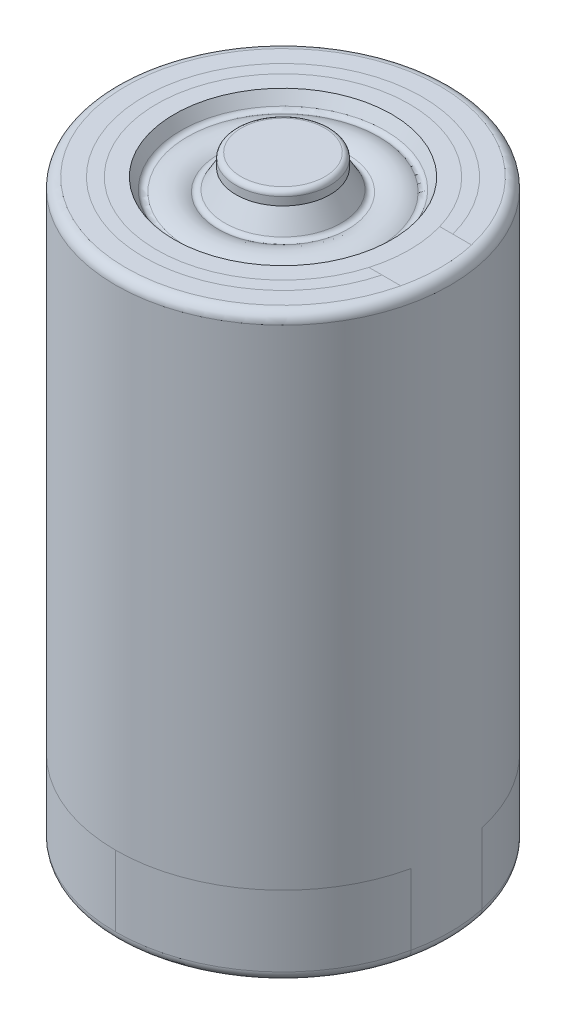
ISO-10303-21;
HEADER;
FILE_DESCRIPTION(('STEP AP214'),'2;1');
FILE_NAME('part.step','',(''),(''),'','','');
FILE_SCHEMA(('AUTOMOTIVE_DESIGN { 1 0 10303 214 1 1 1 1 }'));
ENDSEC;
DATA;
#1=APPLICATION_CONTEXT('core data for automotive mechanical design processes');
#2=APPLICATION_PROTOCOL_DEFINITION('international standard','automotive_design',2000,#1);
#3=PRODUCT_CONTEXT('',#1,'mechanical');
#4=PRODUCT('Part','Part','',(#3));
#5=PRODUCT_RELATED_PRODUCT_CATEGORY('part','',(#4));
#6=PRODUCT_DEFINITION_FORMATION('','',#4);
#7=PRODUCT_DEFINITION_CONTEXT('part definition',#1,'design');
#8=PRODUCT_DEFINITION('design','',#6,#7);
#9=PRODUCT_DEFINITION_SHAPE('','',#8);
#10=(LENGTH_UNIT() NAMED_UNIT(*) SI_UNIT(.MILLI.,.METRE.));
#11=(NAMED_UNIT(*) PLANE_ANGLE_UNIT() SI_UNIT($,.RADIAN.));
#12=(NAMED_UNIT(*) SI_UNIT($,.STERADIAN.) SOLID_ANGLE_UNIT());
#13=UNCERTAINTY_MEASURE_WITH_UNIT(LENGTH_MEASURE(1.E-05),#10,'distance_accuracy_value','');
#14=(GEOMETRIC_REPRESENTATION_CONTEXT(3) GLOBAL_UNCERTAINTY_ASSIGNED_CONTEXT((#13)) GLOBAL_UNIT_ASSIGNED_CONTEXT((#10,
#11,#12)) REPRESENTATION_CONTEXT('',''));
#15=CARTESIAN_POINT('',(0.,0.,0.));
#16=DIRECTION('',(0.,0.,1.));
#17=DIRECTION('',(1.,0.,0.));
#18=AXIS2_PLACEMENT_3D('',#15,#16,#17);
#19=CARTESIAN_POINT('',(15.55,58.9,0.));
#20=DIRECTION('',(0.,1.,0.));
#21=DIRECTION('',(0.,0.,1.));
#22=AXIS2_PLACEMENT_3D('',#19,#20,#21);
#23=PLANE('',#22);
#24=DIRECTION('',(-1.,0.,0.));
#25=VECTOR('',#24,1.);
#26=CARTESIAN_POINT('',(15.55,58.9,-3.5));
#27=LINE('',#26,#25);
#28=CARTESIAN_POINT('',(13.2970861469722,58.9,-3.5));
#29=VERTEX_POINT('',#28);
#30=CARTESIAN_POINT('',(12.,58.9,-3.5));
#31=VERTEX_POINT('',#30);
#32=EDGE_CURVE('E296',#29,#31,#27,.T.);
#33=ORIENTED_EDGE('',*,*,#32,.F.);
#34=CARTESIAN_POINT('',(0.,58.9,0.));
#35=DIRECTION('',(0.,1.,0.));
#36=DIRECTION('',(0.,0.,1.));
#37=AXIS2_PLACEMENT_3D('',#34,#35,#36);
#38=CIRCLE('',#37,13.75);
#39=CARTESIAN_POINT('',(13.2970861469722,58.9,3.5));
#40=VERTEX_POINT('',#39);
#41=EDGE_CURVE('E11',#29,#40,#38,.T.);
#42=ORIENTED_EDGE('',*,*,#41,.T.);
#43=DIRECTION('',(1.,0.,0.));
#44=VECTOR('',#43,1.);
#45=CARTESIAN_POINT('',(15.55,58.9,3.5));
#46=LINE('',#45,#44);
#47=CARTESIAN_POINT('',(12.,58.9,3.5));
#48=VERTEX_POINT('',#47);
#49=EDGE_CURVE('E297',#48,#40,#46,.T.);
#50=ORIENTED_EDGE('',*,*,#49,.F.);
#51=CARTESIAN_POINT('',(0.,58.9,0.));
#52=DIRECTION('',(0.,1.,0.));
#53=DIRECTION('',(0.,0.,1.));
#54=AXIS2_PLACEMENT_3D('',#51,#52,#53);
#55=CIRCLE('',#54,12.5);
#56=EDGE_CURVE('E161',#48,#31,#55,.F.);
#57=ORIENTED_EDGE('',*,*,#56,.T.);
#58=EDGE_LOOP('',(#33,#42,#50,#57));
#59=FACE_BOUND('',#58,.T.);
#60=ADVANCED_FACE('F40',(#59),#23,.T.);
#61=CARTESIAN_POINT('',(0.,58.9,0.));
#62=DIRECTION('',(0.,-1.,0.));
#63=DIRECTION('',(0.,0.,-1.));
#64=AXIS2_PLACEMENT_3D('',#61,#62,#63);
#65=CIRCLE('',#64,15.55);
#66=CARTESIAN_POINT('',(15.150990066659,58.9,-3.5));
#67=VERTEX_POINT('',#66);
#68=CARTESIAN_POINT('',(15.150990066659,58.9,3.5));
#69=VERTEX_POINT('',#68);
#70=EDGE_CURVE('E312',#67,#69,#65,.T.);
#71=ORIENTED_EDGE('',*,*,#70,.F.);
#72=EDGE_CURVE('E49',#67,#29,#27,.T.);
#73=ORIENTED_EDGE('',*,*,#72,.T.);
#74=ORIENTED_EDGE('',*,*,#32,.T.);
#75=EDGE_CURVE('E160',#31,#48,#55,.F.);
#76=ORIENTED_EDGE('',*,*,#75,.T.);
#77=ORIENTED_EDGE('',*,*,#49,.T.);
#78=EDGE_CURVE('E288',#40,#69,#46,.T.);
#79=ORIENTED_EDGE('',*,*,#78,.T.);
#80=EDGE_LOOP('',(#71,#73,#74,#76,#77,#79));
#81=FACE_BOUND('',#80,.T.);
#82=ADVANCED_FACE('F229',(#81),#23,.T.);
#83=CARTESIAN_POINT('',(0.,0.,0.));
#84=DIRECTION('',(0.,-1.,0.));
#85=DIRECTION('',(0.,0.,-1.));
#86=AXIS2_PLACEMENT_3D('',#83,#84,#85);
#87=CYLINDRICAL_SURFACE('',#86,16.55);
#88=CARTESIAN_POINT('',(0.,57.9,0.));
#89=DIRECTION('',(0.,-1.,0.));
#90=DIRECTION('',(0.,0.,-1.));
#91=AXIS2_PLACEMENT_3D('',#88,#89,#90);
#92=CIRCLE('',#91,16.55);
#93=CARTESIAN_POINT('',(0.,57.9,-16.55));
#94=VERTEX_POINT('',#93);
#95=EDGE_CURVE('E130',#94,#94,#92,.T.);
#96=ORIENTED_EDGE('',*,*,#95,.T.);
#97=EDGE_LOOP('',(#96));
#98=FACE_BOUND('',#97,.T.);
#99=CARTESIAN_POINT('',(0.,9.5,0.));
#100=DIRECTION('',(0.,1.,0.));
#101=DIRECTION('',(0.,0.,1.));
#102=AXIS2_PLACEMENT_3D('',#99,#100,#101);
#103=CIRCLE('',#102,16.55);
#104=CARTESIAN_POINT('',(0.,9.5,-16.55));
#105=VERTEX_POINT('',#104);
#106=CARTESIAN_POINT('',(16.1756761837025,9.5,-3.5));
#107=VERTEX_POINT('',#106);
#108=EDGE_CURVE('E120',#105,#107,#103,.F.);
#109=ORIENTED_EDGE('',*,*,#108,.F.);
#110=CARTESIAN_POINT('',(0.,9.5,0.));
#111=DIRECTION('',(0.,-1.,0.));
#112=DIRECTION('',(0.,0.,-1.));
#113=AXIS2_PLACEMENT_3D('',#110,#111,#112);
#114=CIRCLE('',#113,16.55);
#115=CARTESIAN_POINT('',(0.,9.5,16.55));
#116=VERTEX_POINT('',#115);
#117=EDGE_CURVE('E114',#105,#116,#114,.F.);
#118=ORIENTED_EDGE('',*,*,#117,.T.);
#119=CARTESIAN_POINT('',(0.,9.5,0.));
#120=DIRECTION('',(0.,1.,0.));
#121=DIRECTION('',(0.,0.,1.));
#122=AXIS2_PLACEMENT_3D('',#119,#120,#121);
#123=CIRCLE('',#122,16.55);
#124=CARTESIAN_POINT('',(16.1756761837025,9.5,3.5));
#125=VERTEX_POINT('',#124);
#126=EDGE_CURVE('E171',#125,#116,#123,.F.);
#127=ORIENTED_EDGE('',*,*,#126,.F.);
#128=DIRECTION('',(0.,-1.,0.));
#129=VECTOR('',#128,1.);
#130=CARTESIAN_POINT('',(16.1756761837025,0.,3.5));
#131=LINE('',#130,#129);
#132=CARTESIAN_POINT('',(16.1756761837025,2.5,3.5));
#133=VERTEX_POINT('',#132);
#134=EDGE_CURVE('E175',#133,#125,#131,.F.);
#135=ORIENTED_EDGE('',*,*,#134,.F.);
#136=CARTESIAN_POINT('',(0.,2.5,0.));
#137=DIRECTION('',(0.,-1.,0.));
#138=DIRECTION('',(0.,0.,-1.));
#139=AXIS2_PLACEMENT_3D('',#136,#137,#138);
#140=CIRCLE('',#139,16.55);
#141=CARTESIAN_POINT('',(16.1756761837025,2.5,-3.5));
#142=VERTEX_POINT('',#141);
#143=EDGE_CURVE('E138',#142,#133,#140,.T.);
#144=ORIENTED_EDGE('',*,*,#143,.F.);
#145=DIRECTION('',(0.,-1.,0.));
#146=VECTOR('',#145,1.);
#147=CARTESIAN_POINT('',(16.1756761837025,0.,-3.5));
#148=LINE('',#147,#146);
#149=EDGE_CURVE('E135',#107,#142,#148,.T.);
#150=ORIENTED_EDGE('',*,*,#149,.F.);
#151=EDGE_LOOP('',(#109,#118,#127,#135,#144,#150));
#152=FACE_BOUND('',#151,.T.);
#153=ADVANCED_FACE('F226',(#98,#152),#87,.T.);
#154=CARTESIAN_POINT('',(12.5,1.5,0.));
#155=DIRECTION('',(0.,-1.,0.));
#156=DIRECTION('',(0.,0.,-1.));
#157=AXIS2_PLACEMENT_3D('',#154,#155,#156);
#158=PLANE('',#157);
#159=CARTESIAN_POINT('',(0.,1.5,0.));
#160=DIRECTION('',(0.,-1.,0.));
#161=DIRECTION('',(0.,0.,-1.));
#162=AXIS2_PLACEMENT_3D('',#159,#160,#161);
#163=CIRCLE('',#162,12.5);
#164=CARTESIAN_POINT('',(12.,1.5,3.5));
#165=VERTEX_POINT('',#164);
#166=CARTESIAN_POINT('',(12.,1.5,-3.5));
#167=VERTEX_POINT('',#166);
#168=EDGE_CURVE('E147',#165,#167,#163,.T.);
#169=ORIENTED_EDGE('',*,*,#168,.F.);
#170=DIRECTION('',(1.,0.,0.));
#171=VECTOR('',#170,1.);
#172=CARTESIAN_POINT('',(12.5,1.5,3.5));
#173=LINE('',#172,#171);
#174=CARTESIAN_POINT('',(15.150990066659,1.5,3.5));
#175=VERTEX_POINT('',#174);
#176=EDGE_CURVE('E179',#165,#175,#173,.T.);
#177=ORIENTED_EDGE('',*,*,#176,.T.);
#178=CARTESIAN_POINT('',(0.,1.5,0.));
#179=DIRECTION('',(0.,-1.,0.));
#180=DIRECTION('',(0.,0.,-1.));
#181=AXIS2_PLACEMENT_3D('',#178,#179,#180);
#182=CIRCLE('',#181,15.55);
#183=CARTESIAN_POINT('',(15.150990066659,1.5,-3.5));
#184=VERTEX_POINT('',#183);
#185=EDGE_CURVE('E137',#175,#184,#182,.T.);
#186=ORIENTED_EDGE('',*,*,#185,.T.);
#187=DIRECTION('',(-1.,0.,0.));
#188=VECTOR('',#187,1.);
#189=CARTESIAN_POINT('',(12.5,1.5,-3.5));
#190=LINE('',#189,#188);
#191=EDGE_CURVE('E182',#184,#167,#190,.T.);
#192=ORIENTED_EDGE('',*,*,#191,.T.);
#193=EDGE_LOOP('',(#169,#177,#186,#192));
#194=FACE_BOUND('',#193,.T.);
#195=ADVANCED_FACE('F219',(#194),#158,.T.);
#196=CARTESIAN_POINT('',(0.,2.5,0.));
#197=DIRECTION('',(0.,-1.,0.));
#198=DIRECTION('',(0.,0.,-1.));
#199=AXIS2_PLACEMENT_3D('',#196,#197,#198);
#200=TOROIDAL_SURFACE('',#199,15.55,1.);
#201=ORIENTED_EDGE('',*,*,#185,.F.);
#202=CARTESIAN_POINT('',(14.1792530394342,2.17340566572106,3.5));
#203=CARTESIAN_POINT('',(14.1980885138474,2.12049279659511,3.5));
#204=CARTESIAN_POINT('',(14.2214972506418,2.0691583762498,3.5));
#205=CARTESIAN_POINT('',(14.2766855043797,1.97114621986057,3.5));
#206=CARTESIAN_POINT('',(14.3084772069403,1.92447540020742,3.5));
#207=CARTESIAN_POINT('',(14.3793475188211,1.83716868918232,3.5));
#208=CARTESIAN_POINT('',(14.4184141657294,1.7965230846489,3.5));
#209=CARTESIAN_POINT('',(14.5026793451496,1.72222042642383,3.5));
#210=CARTESIAN_POINT('',(14.5478764693641,1.68856177216556,3.5));
#211=CARTESIAN_POINT('',(14.644105494877,1.62841342255395,3.5));
#212=CARTESIAN_POINT('',(14.6952378387754,1.60208445776696,3.5));
#213=CARTESIAN_POINT('',(14.801126945938,1.55815607837396,3.5));
#214=CARTESIAN_POINT('',(14.8558843301604,1.54055816377804,3.5));
#215=CARTESIAN_POINT('',(14.968847536997,1.51420411668053,3.5));
#216=CARTESIAN_POINT('',(15.0271041416763,1.50566530267801,3.5));
#217=CARTESIAN_POINT('',(15.1442286742494,1.49838891803839,3.5));
#218=CARTESIAN_POINT('',(15.2030966474452,1.49965207896906,3.5));
#219=CARTESIAN_POINT('',(15.3203425768103,1.51202610271029,3.5));
#220=CARTESIAN_POINT('',(15.378711002042,1.52322770824379,3.5));
#221=CARTESIAN_POINT('',(15.4927137555938,1.55534767112197,3.5));
#222=CARTESIAN_POINT('',(15.5483481420383,1.57626582179862,3.5));
#223=CARTESIAN_POINT('',(15.6548075156251,1.62709965563068,3.5));
#224=CARTESIAN_POINT('',(15.7056669842364,1.65694304922122,3.5));
#225=CARTESIAN_POINT('',(15.8015165521876,1.72491225428569,3.5));
#226=CARTESIAN_POINT('',(15.8465072488182,1.76303722185312,3.5));
#227=CARTESIAN_POINT('',(15.9283481648053,1.84567135588212,3.5));
#228=CARTESIAN_POINT('',(15.9653452353455,1.89003503662328,3.5));
#229=CARTESIAN_POINT('',(16.0311523368344,1.98446922935521,3.5));
#230=CARTESIAN_POINT('',(16.0599634965048,2.0345389532279,3.5));
#231=CARTESIAN_POINT('',(16.1078783990741,2.13770019930855,3.5));
#232=CARTESIAN_POINT('',(16.1271936016183,2.19069354266517,3.5));
#233=CARTESIAN_POINT('',(16.1564793898157,2.29920171347817,3.5));
#234=CARTESIAN_POINT('',(16.1664510074074,2.35471626177355,3.5));
#235=CARTESIAN_POINT('',(16.1766338711888,2.46568029167508,3.5));
#236=CARTESIAN_POINT('',(16.1770078363382,2.52111489861636,3.5));
#237=CARTESIAN_POINT('',(16.1683977588488,2.63125045383887,3.5));
#238=CARTESIAN_POINT('',(16.1594141361335,2.68595143493014,3.5));
#239=CARTESIAN_POINT('',(16.1324377153513,2.79282593225581,3.5));
#240=CARTESIAN_POINT('',(16.1144845434958,2.84500946795584,3.5));
#241=CARTESIAN_POINT('',(16.0701516266678,2.94566192610818,3.5));
#242=CARTESIAN_POINT('',(16.0437716345368,2.99413073955596,3.5));
#243=CARTESIAN_POINT('',(15.9831016507719,3.08648995131144,3.5));
#244=CARTESIAN_POINT('',(15.9487393302178,3.13033280322636,3.5));
#245=CARTESIAN_POINT('',(15.8732726955601,3.21176690998437,3.5));
#246=CARTESIAN_POINT('',(15.8321677852943,3.24935761143622,3.5));
#247=CARTESIAN_POINT('',(15.7435238421898,3.31802698337334,3.5));
#248=CARTESIAN_POINT('',(15.6958734832165,3.34896190321056,3.5));
#249=CARTESIAN_POINT('',(15.5961483269654,3.40260316987112,3.5));
#250=CARTESIAN_POINT('',(15.5440730027686,3.42530853502999,3.5));
#251=CARTESIAN_POINT('',(15.4356864485562,3.46238999863009,3.5));
#252=CARTESIAN_POINT('',(15.3793050715459,3.47656113649083,3.5));
#253=CARTESIAN_POINT('',(15.2649771265665,3.49541815122838,3.5));
#254=CARTESIAN_POINT('',(15.2070303895885,3.50010299970875,3.5));
#255=CARTESIAN_POINT('',(15.0901343313939,3.49989173807861,3.5));
#256=CARTESIAN_POINT('',(15.0311852546874,3.49482611365658,3.5));
#257=CARTESIAN_POINT('',(14.9149597562041,3.47491202152046,3.5));
#258=CARTESIAN_POINT('',(14.8576834261679,3.46006301829179,3.5));
#259=CARTESIAN_POINT('',(14.7462285367284,3.42087819143804,3.5));
#260=CARTESIAN_POINT('',(14.6920622707713,3.39650734319539,3.5));
#261=CARTESIAN_POINT('',(14.5886660287345,3.33889683289107,3.5));
#262=CARTESIAN_POINT('',(14.5394358148297,3.30565759840205,3.5));
#263=CARTESIAN_POINT('',(14.4480715799828,3.23169524558589,3.5));
#264=CARTESIAN_POINT('',(14.4058495527422,3.19108093673123,3.5));
#265=CARTESIAN_POINT('',(14.3290510529767,3.10317214968824,3.5));
#266=CARTESIAN_POINT('',(14.2944731258329,3.05587894525907,3.5));
#267=CARTESIAN_POINT('',(14.2349339944407,2.9572928695666,3.5));
#268=CARTESIAN_POINT('',(14.2097419998531,2.90613939304389,3.5));
#269=CARTESIAN_POINT('',(14.1685645793199,2.80023507331703,3.5));
#270=CARTESIAN_POINT('',(14.1525800160275,2.74548389357575,3.5));
#271=CARTESIAN_POINT('',(14.1306760327388,2.63548524437515,3.5));
#272=CARTESIAN_POINT('',(14.124506992378,2.58028723235342,3.5));
#273=CARTESIAN_POINT('',(14.1216672432118,2.46969773329597,3.5));
#274=CARTESIAN_POINT('',(14.1249834733281,2.41430661710373,3.5));
#275=CARTESIAN_POINT('',(14.1375927354538,2.32793353360577,3.5));
#276=CARTESIAN_POINT('',(14.1437915309908,2.2964681845692,3.5));
#277=CARTESIAN_POINT('',(14.1592483577381,2.2342991767761,3.5));
#278=CARTESIAN_POINT('',(14.1685063181158,2.20359550040128,3.5));
#279=CARTESIAN_POINT('',(14.1792530394342,2.17340566572106,3.5));
#280=B_SPLINE_CURVE_WITH_KNOTS('',3,(#202,#203,#204,#205,#206,#207,#208,#209,#210,#211,#212,
#213,#214,#215,#216,#217,#218,#219,#220,#221,#222,#223,#224,#225,#226,#227,#228,#229,#230,#231,
#232,#233,#234,#235,#236,#237,#238,#239,#240,#241,#242,#243,#244,#245,#246,#247,#248,#249,#250,
#251,#252,#253,#254,#255,#256,#257,#258,#259,#260,#261,#262,#263,#264,#265,#266,#267,#268,#269,
#270,#271,#272,#273,#274,#275,#276,#277,#278,#279),.UNSPECIFIED.,.T.,.F.,(4,2,2,2,2,2,2,2,2,2,2,
2,2,2,2,2,2,2,2,2,2,2,2,2,2,2,2,2,2,2,2,2,2,2,2,2,2,2,4),(0.,0.168375191465292,
0.336996498205606,0.505342945678527,0.673650785780169,0.845401490657697,1.01718169240563,
1.19299549836645,1.36882242627011,1.54627145009113,1.72371669979674,1.89976196669544,
2.07578930269005,2.24823938806772,2.42066568345953,2.58905551344316,2.75742674366602,
2.92294148087218,3.08844879089243,3.25323129403098,3.4180186306844,3.58436176747291,
3.75071961982256,3.92037292488756,4.09004646043412,4.26364739098436,4.43726714038093,
4.61393258988481,4.7906077103609,4.96793891538548,5.14526157226223,5.32015403019636,
5.49501317861412,5.66523340280073,5.8354695724936,6.00130296919659,6.16690812572114,
6.262978079427,6.35904580885761),.UNSPECIFIED.);
#281=EDGE_CURVE('E185',#175,#133,#280,.T.);
#282=ORIENTED_EDGE('',*,*,#281,.T.);
#283=CARTESIAN_POINT('',(0.,2.5,16.55));
#284=VERTEX_POINT('',#283);
#285=EDGE_CURVE('E129',#133,#284,#140,.T.);
#286=ORIENTED_EDGE('',*,*,#285,.T.);
#287=CARTESIAN_POINT('',(0.,2.5,-16.55));
#288=VERTEX_POINT('',#287);
#289=EDGE_CURVE('E112',#284,#288,#140,.T.);
#290=ORIENTED_EDGE('',*,*,#289,.T.);
#291=EDGE_CURVE('E127',#288,#142,#140,.T.);
#292=ORIENTED_EDGE('',*,*,#291,.T.);
#293=CARTESIAN_POINT('',(14.1792530394342,2.17340566572106,-3.5));
#294=CARTESIAN_POINT('',(14.1609222950065,2.22491621097577,-3.5));
#295=CARTESIAN_POINT('',(14.1468977634147,2.27799719610933,-3.5));
#296=CARTESIAN_POINT('',(14.1279536754817,2.38579918462007,-3.5));
#297=CARTESIAN_POINT('',(14.1230430764598,2.44052174776349,-3.5));
#298=CARTESIAN_POINT('',(14.122510677666,2.55000090507969,-3.5));
#299=CARTESIAN_POINT('',(14.1268862415859,2.60475748518316,-3.5));
#300=CARTESIAN_POINT('',(14.1447733709821,2.71274291742323,-3.5));
#301=CARTESIAN_POINT('',(14.1582832031468,2.76597205740837,-3.5));
#302=CARTESIAN_POINT('',(14.1939873706628,2.86942669122505,-3.5));
#303=CARTESIAN_POINT('',(14.2161814446723,2.91965227539258,-3.5));
#304=CARTESIAN_POINT('',(14.2685456261083,3.01575500909275,-3.5));
#305=CARTESIAN_POINT('',(14.2987165063296,3.0616317367218,-3.5));
#306=CARTESIAN_POINT('',(14.366715164839,3.14862553184318,-3.5));
#307=CARTESIAN_POINT('',(14.404668988134,3.18964400955377,-3.5));
#308=CARTESIAN_POINT('',(14.4867602507689,3.26493557017998,-3.5));
#309=CARTESIAN_POINT('',(14.5308985060008,3.29920776164286,-3.5));
#310=CARTESIAN_POINT('',(14.6253955147586,3.36102645443747,-3.5));
#311=CARTESIAN_POINT('',(14.6758913771649,3.3883633838396,-3.5));
#312=CARTESIAN_POINT('',(14.780677022914,3.43440164803204,-3.5));
#313=CARTESIAN_POINT('',(14.8349673097577,3.45310183425588,-3.5));
#314=CARTESIAN_POINT('',(14.9472007925616,3.48176577511776,-3.5));
#315=CARTESIAN_POINT('',(15.0052003982373,3.49150898187393,-3.5));
#316=CARTESIAN_POINT('',(15.1220145903185,3.50123109136168,-3.5));
#317=CARTESIAN_POINT('',(15.1808292419767,3.50120920772972,-3.5));
#318=CARTESIAN_POINT('',(15.2982413684075,3.49133171259808,-3.5));
#319=CARTESIAN_POINT('',(15.356830382534,3.48137492565717,-3.5));
#320=CARTESIAN_POINT('',(15.4714855612331,3.45169970530641,-3.5));
#321=CARTESIAN_POINT('',(15.5275517577623,3.43198139558445,-3.5));
#322=CARTESIAN_POINT('',(15.6351308383301,3.38343478329728,-3.5));
#323=CARTESIAN_POINT('',(15.6866723977413,3.35467009689628,-3.5));
#324=CARTESIAN_POINT('',(15.7840648629202,3.28873005208754,-3.5));
#325=CARTESIAN_POINT('',(15.8299163314966,3.25155552652793,-3.5));
#326=CARTESIAN_POINT('',(15.9136390101968,3.17062284006579,-3.5));
#327=CARTESIAN_POINT('',(15.9516501821462,3.12700951538405,-3.5));
#328=CARTESIAN_POINT('',(16.019598748762,3.0338896656961,-3.5));
#329=CARTESIAN_POINT('',(16.049537250637,2.98438395020591,-3.5));
#330=CARTESIAN_POINT('',(16.0997540540722,2.88213938185274,-3.5));
#331=CARTESIAN_POINT('',(16.1202429744163,2.82950393997623,-3.5));
#332=CARTESIAN_POINT('',(16.1519137175737,2.72150423527792,-3.5));
#333=CARTESIAN_POINT('',(16.1630965986468,2.66614028349418,-3.5));
#334=CARTESIAN_POINT('',(16.1756743992253,2.55530170007038,-3.5));
#335=CARTESIAN_POINT('',(16.1772381194724,2.49984616519411,-3.5));
#336=CARTESIAN_POINT('',(16.1709782065751,2.3894694944497,-3.5));
#337=CARTESIAN_POINT('',(16.163155039399,2.33454833219156,-3.5));
#338=CARTESIAN_POINT('',(16.1384397385245,2.22709428794779,-3.5));
#339=CARTESIAN_POINT('',(16.1215955312153,2.17455036172479,-3.5));
#340=CARTESIAN_POINT('',(16.0793980747165,2.07300134789384,-3.5));
#341=CARTESIAN_POINT('',(16.0540446104031,2.02399634979216,-3.5));
#342=CARTESIAN_POINT('',(15.9953498860723,1.93044128958771,-3.5));
#343=CARTESIAN_POINT('',(15.9619415866721,1.88593331837568,-3.5));
#344=CARTESIAN_POINT('',(15.8882573954095,1.80302458161836,-3.5));
#345=CARTESIAN_POINT('',(15.8479809234463,1.76462433247456,-3.5));
#346=CARTESIAN_POINT('',(15.7608839955592,1.69421544722668,-3.5));
#347=CARTESIAN_POINT('',(15.7139520755659,1.66234473783164,-3.5));
#348=CARTESIAN_POINT('',(15.6155008324598,1.60672657443792,-3.5));
#349=CARTESIAN_POINT('',(15.5639809594728,1.58298009579843,-3.5));
#350=CARTESIAN_POINT('',(15.4565383657761,1.54371177780737,-3.5));
#351=CARTESIAN_POINT('',(15.4005412510105,1.52839342966933,-3.5));
#352=CARTESIAN_POINT('',(15.2867881615321,1.5071883191578,-3.5));
#353=CARTESIAN_POINT('',(15.2290319894475,1.50130261915858,-3.5));
#354=CARTESIAN_POINT('',(15.1122813836268,1.49906436144752,-3.5));
#355=CARTESIAN_POINT('',(15.0532835284746,1.50288707343176,-3.5));
#356=CARTESIAN_POINT('',(14.9367533186237,1.52033023673236,-3.5));
#357=CARTESIAN_POINT('',(14.8792209937832,1.53395088750311,-3.5));
#358=CARTESIAN_POINT('',(14.7669909172335,1.57073624130917,-3.5));
#359=CARTESIAN_POINT('',(14.7123076098373,1.5939450843218,-3.5));
#360=CARTESIAN_POINT('',(14.6076662347656,1.64933406976874,-3.5));
#361=CARTESIAN_POINT('',(14.5577091497598,1.68151607242395,-3.5));
#362=CARTESIAN_POINT('',(14.4646523315352,1.75355809823595,-3.5));
#363=CARTESIAN_POINT('',(14.4214764843814,1.79331982485943,-3.5));
#364=CARTESIAN_POINT('',(14.3426756431821,1.8796705273337,-3.5));
#365=CARTESIAN_POINT('',(14.3070403016784,1.9262499969859,-3.5));
#366=CARTESIAN_POINT('',(14.2560725060756,2.00660642176866,-3.5));
#367=CARTESIAN_POINT('',(14.2381064835627,2.03874350047948,-3.5));
#368=CARTESIAN_POINT('',(14.2058619013813,2.10481877612477,-3.5));
#369=CARTESIAN_POINT('',(14.191583271203,2.13875693860423,-3.5));
#370=CARTESIAN_POINT('',(14.1792530394342,2.17340566572106,-3.5));
#371=B_SPLINE_CURVE_WITH_KNOTS('',3,(#293,#294,#295,#296,#297,#298,#299,#300,#301,#302,#303,
#304,#305,#306,#307,#308,#309,#310,#311,#312,#313,#314,#315,#316,#317,#318,#319,#320,#321,#322,
#323,#324,#325,#326,#327,#328,#329,#330,#331,#332,#333,#334,#335,#336,#337,#338,#339,#340,#341,
#342,#343,#344,#345,#346,#347,#348,#349,#350,#351,#352,#353,#354,#355,#356,#357,#358,#359,#360,
#361,#362,#363,#364,#365,#366,#367,#368,#369,#370),.UNSPECIFIED.,.T.,.F.,(4,2,2,2,2,2,2,2,2,2,2,
2,2,2,2,2,2,2,2,2,2,2,2,2,2,2,2,2,2,2,2,2,2,2,2,2,2,2,4),(0.,0.163892126883478,
0.327945244456745,0.491951794169707,0.655927230858092,0.819897733281622,0.983884127030807,
1.15077233695034,1.31768258465806,1.48915759347397,1.66065539951466,1.83627097244347,
2.01190068735208,2.18933743017591,2.36677192476317,2.54298555542883,2.71918174283592,
2.89189129438413,3.0645771458543,3.23320200022772,3.40180767637738,3.5674459531597,
3.73307600794223,3.89783471873896,4.06259759514091,4.22878222138923,4.39498089091296,
4.56439278459236,4.73382500998253,4.90718621497586,5.08056694381262,5.25709994548532,
5.43363654090159,5.61099505589527,5.78839036636002,5.96362491879542,6.13861742342475,
6.24886207622954,6.35910462079789),.UNSPECIFIED.);
#372=EDGE_CURVE('E178',#142,#184,#371,.T.);
#373=ORIENTED_EDGE('',*,*,#372,.T.);
#374=EDGE_LOOP('',(#201,#282,#286,#290,#292,#373));
#375=FACE_BOUND('',#374,.T.);
#376=ADVANCED_FACE('F125',(#375),#200,.T.);
#377=ORIENTED_EDGE('',*,*,#285,.F.);
#378=ORIENTED_EDGE('',*,*,#134,.T.);
#379=ORIENTED_EDGE('',*,*,#126,.T.);
#380=DIRECTION('',(0.,-1.,0.));
#381=VECTOR('',#380,1.);
#382=CARTESIAN_POINT('',(0.,0.,16.55));
#383=LINE('',#382,#381);
#384=EDGE_CURVE('E119',#284,#116,#383,.F.);
#385=ORIENTED_EDGE('',*,*,#384,.F.);
#386=EDGE_LOOP('',(#377,#378,#379,#385));
#387=FACE_BOUND('',#386,.T.);
#388=ADVANCED_FACE('F256',(#387),#87,.T.);
#389=ORIENTED_EDGE('',*,*,#291,.F.);
#390=DIRECTION('',(0.,-1.,0.));
#391=VECTOR('',#390,1.);
#392=CARTESIAN_POINT('',(0.,0.,-16.55));
#393=LINE('',#392,#391);
#394=EDGE_CURVE('E108',#288,#105,#393,.F.);
#395=ORIENTED_EDGE('',*,*,#394,.T.);
#396=ORIENTED_EDGE('',*,*,#108,.T.);
#397=ORIENTED_EDGE('',*,*,#149,.T.);
#398=EDGE_LOOP('',(#389,#395,#396,#397));
#399=FACE_BOUND('',#398,.T.);
#400=ADVANCED_FACE('F133',(#399),#87,.T.);
#401=ORIENTED_EDGE('',*,*,#41,.F.);
#402=ORIENTED_EDGE('',*,*,#72,.F.);
#403=EDGE_CURVE('E316',#69,#67,#65,.T.);
#404=ORIENTED_EDGE('',*,*,#403,.F.);
#405=ORIENTED_EDGE('',*,*,#78,.F.);
#406=EDGE_LOOP('',(#401,#402,#404,#405));
#407=FACE_BOUND('',#406,.T.);
#408=ADVANCED_FACE('F204',(#407),#23,.T.);
#409=CARTESIAN_POINT('',(0.,0.,0.));
#410=DIRECTION('',(0.,-1.,0.));
#411=DIRECTION('',(0.,0.,-1.));
#412=AXIS2_PLACEMENT_3D('',#409,#410,#411);
#413=PLANE('',#412);
#414=CARTESIAN_POINT('',(0.,0.,0.));
#415=DIRECTION('',(0.,-1.,0.));
#416=DIRECTION('',(0.,0.,-1.));
#417=AXIS2_PLACEMENT_3D('',#414,#415,#416);
#418=CIRCLE('',#417,9.);
#419=CARTESIAN_POINT('',(0.,0.,-9.));
#420=VERTEX_POINT('',#419);
#421=EDGE_CURVE('E157',#420,#420,#418,.T.);
#422=ORIENTED_EDGE('',*,*,#421,.T.);
#423=EDGE_LOOP('',(#422));
#424=FACE_BOUND('',#423,.T.);
#425=ADVANCED_FACE('F200',(#424),#413,.T.);
#426=CARTESIAN_POINT('',(0.,0.,0.));
#427=DIRECTION('',(0.,1.,0.));
#428=DIRECTION('',(0.,0.,1.));
#429=AXIS2_PLACEMENT_3D('',#426,#427,#428);
#430=CONICAL_SURFACE('',#429,9.,1.0471975511966);
#431=CARTESIAN_POINT('',(0.,0.5,0.));
#432=DIRECTION('',(0.,-1.,0.));
#433=DIRECTION('',(0.,0.,-1.));
#434=AXIS2_PLACEMENT_3D('',#431,#432,#433);
#435=CIRCLE('',#434,9.86602540378444);
#436=CARTESIAN_POINT('',(0.,0.5,-9.86602540378444));
#437=VERTEX_POINT('',#436);
#438=EDGE_CURVE('E154',#437,#437,#435,.T.);
#439=ORIENTED_EDGE('',*,*,#438,.T.);
#440=EDGE_LOOP('',(#439));
#441=FACE_BOUND('',#440,.T.);
#442=ORIENTED_EDGE('',*,*,#421,.F.);
#443=EDGE_LOOP('',(#442));
#444=FACE_BOUND('',#443,.T.);
#445=ADVANCED_FACE('F203',(#441,#444),#430,.T.);
#446=CARTESIAN_POINT('',(9.86602540378444,0.5,0.));
#447=DIRECTION('',(0.,-1.,0.));
#448=DIRECTION('',(0.,0.,-1.));
#449=AXIS2_PLACEMENT_3D('',#446,#447,#448);
#450=PLANE('',#449);
#451=CARTESIAN_POINT('',(0.,0.5,0.));
#452=DIRECTION('',(0.,-1.,0.));
#453=DIRECTION('',(0.,0.,-1.));
#454=AXIS2_PLACEMENT_3D('',#451,#452,#453);
#455=CIRCLE('',#454,11.5);
#456=CARTESIAN_POINT('',(0.,0.5,-11.5));
#457=VERTEX_POINT('',#456);
#458=EDGE_CURVE('E151',#457,#457,#455,.T.);
#459=ORIENTED_EDGE('',*,*,#458,.T.);
#460=EDGE_LOOP('',(#459));
#461=FACE_BOUND('',#460,.T.);
#462=ORIENTED_EDGE('',*,*,#438,.F.);
#463=EDGE_LOOP('',(#462));
#464=FACE_BOUND('',#463,.T.);
#465=ADVANCED_FACE('F208',(#461,#464),#450,.T.);
#466=CARTESIAN_POINT('',(0.,1.5,0.));
#467=DIRECTION('',(0.,-1.,0.));
#468=DIRECTION('',(0.,0.,-1.));
#469=AXIS2_PLACEMENT_3D('',#466,#467,#468);
#470=TOROIDAL_SURFACE('',#469,11.5,1.);
#471=EDGE_CURVE('E148',#167,#165,#163,.T.);
#472=ORIENTED_EDGE('',*,*,#471,.T.);
#473=ORIENTED_EDGE('',*,*,#168,.T.);
#474=EDGE_LOOP('',(#472,#473));
#475=FACE_BOUND('',#474,.T.);
#476=ORIENTED_EDGE('',*,*,#458,.F.);
#477=EDGE_LOOP('',(#476));
#478=FACE_BOUND('',#477,.T.);
#479=ADVANCED_FACE('F212',(#475,#478),#470,.T.);
#480=ORIENTED_EDGE('',*,*,#176,.F.);
#481=ORIENTED_EDGE('',*,*,#471,.F.);
#482=ORIENTED_EDGE('',*,*,#191,.F.);
#483=EDGE_CURVE('E140',#184,#175,#182,.T.);
#484=ORIENTED_EDGE('',*,*,#483,.T.);
#485=EDGE_LOOP('',(#480,#481,#482,#484));
#486=FACE_BOUND('',#485,.T.);
#487=ADVANCED_FACE('F215',(#486),#158,.T.);
#488=ORIENTED_EDGE('',*,*,#281,.F.);
#489=ORIENTED_EDGE('',*,*,#483,.F.);
#490=ORIENTED_EDGE('',*,*,#372,.F.);
#491=ORIENTED_EDGE('',*,*,#143,.T.);
#492=EDGE_LOOP('',(#488,#489,#490,#491));
#493=FACE_BOUND('',#492,.T.);
#494=ADVANCED_FACE('F194',(#493),#200,.T.);
#495=ORIENTED_EDGE('',*,*,#117,.F.);
#496=ORIENTED_EDGE('',*,*,#394,.F.);
#497=ORIENTED_EDGE('',*,*,#289,.F.);
#498=ORIENTED_EDGE('',*,*,#384,.T.);
#499=EDGE_LOOP('',(#495,#496,#497,#498));
#500=FACE_BOUND('',#499,.T.);
#501=ADVANCED_FACE('F110',(#500),#87,.T.);
#502=CARTESIAN_POINT('',(0.,57.9,0.));
#503=DIRECTION('',(0.,-1.,0.));
#504=DIRECTION('',(0.,0.,-1.));
#505=AXIS2_PLACEMENT_3D('',#502,#503,#504);
#506=TOROIDAL_SURFACE('',#505,15.55,1.);
#507=ORIENTED_EDGE('',*,*,#403,.T.);
#508=ORIENTED_EDGE('',*,*,#70,.T.);
#509=EDGE_LOOP('',(#507,#508));
#510=FACE_BOUND('',#509,.T.);
#511=ORIENTED_EDGE('',*,*,#95,.F.);
#512=EDGE_LOOP('',(#511));
#513=FACE_BOUND('',#512,.T.);
#514=ADVANCED_FACE('F241',(#510,#513),#506,.T.);
#515=ORIENTED_EDGE('',*,*,#56,.F.);
#516=ORIENTED_EDGE('',*,*,#75,.F.);
#517=EDGE_LOOP('',(#515,#516));
#518=FACE_BOUND('',#517,.T.);
#519=CARTESIAN_POINT('',(0.,58.9,0.));
#520=DIRECTION('',(0.,-1.,0.));
#521=DIRECTION('',(0.,0.,-1.));
#522=AXIS2_PLACEMENT_3D('',#519,#520,#521);
#523=CIRCLE('',#522,10.75);
#524=CARTESIAN_POINT('',(0.,58.9,-10.75));
#525=VERTEX_POINT('',#524);
#526=EDGE_CURVE('E317',#525,#525,#523,.T.);
#527=ORIENTED_EDGE('',*,*,#526,.T.);
#528=EDGE_LOOP('',(#527));
#529=FACE_BOUND('',#528,.T.);
#530=ADVANCED_FACE('F231',(#518,#529),#23,.T.);
#531=CARTESIAN_POINT('',(0.,58.9,0.));
#532=DIRECTION('',(0.,1.,0.));
#533=DIRECTION('',(0.,0.,1.));
#534=AXIS2_PLACEMENT_3D('',#531,#532,#533);
#535=CONICAL_SURFACE('',#534,10.75,0.523598775598295);
#536=CARTESIAN_POINT('',(0.,57.8113251934625,0.));
#537=DIRECTION('',(0.,-1.,0.));
#538=DIRECTION('',(0.,0.,-1.));
#539=AXIS2_PLACEMENT_3D('',#536,#537,#538);
#540=CIRCLE('',#539,10.1214533073856);
#541=CARTESIAN_POINT('',(0.,57.8113251934625,-10.1214533073856));
#542=VERTEX_POINT('',#541);
#543=EDGE_CURVE('E321',#542,#542,#540,.T.);
#544=ORIENTED_EDGE('',*,*,#543,.T.);
#545=EDGE_LOOP('',(#544));
#546=FACE_BOUND('',#545,.T.);
#547=ORIENTED_EDGE('',*,*,#526,.F.);
#548=EDGE_LOOP('',(#547));
#549=FACE_BOUND('',#548,.T.);
#550=ADVANCED_FACE('F240',(#546,#549),#535,.F.);
#551=CARTESIAN_POINT('',(0.,58.0613251934625,0.));
#552=DIRECTION('',(0.,-1.,0.));
#553=DIRECTION('',(0.,0.,-1.));
#554=AXIS2_PLACEMENT_3D('',#551,#552,#553);
#555=TOROIDAL_SURFACE('',#554,9.68844060549338,0.499999999999995);
#556=CARTESIAN_POINT('',(0.,57.6199723438076,0.));
#557=DIRECTION('',(0.,-1.,0.));
#558=DIRECTION('',(0.,0.,-1.));
#559=AXIS2_PLACEMENT_3D('',#556,#557,#558);
#560=CIRCLE('',#559,9.45347749753484);
#561=CARTESIAN_POINT('',(0.,57.6199723438076,-9.45347749753484));
#562=VERTEX_POINT('',#561);
#563=EDGE_CURVE('E324',#562,#562,#560,.T.);
#564=ORIENTED_EDGE('',*,*,#563,.T.);
#565=EDGE_LOOP('',(#564));
#566=FACE_BOUND('',#565,.T.);
#567=ORIENTED_EDGE('',*,*,#543,.F.);
#568=EDGE_LOOP('',(#567));
#569=FACE_BOUND('',#568,.T.);
#570=ADVANCED_FACE('F247',(#566,#569),#555,.F.);
#571=CARTESIAN_POINT('',(0.,54.7600501136382,0.));
#572=DIRECTION('',(0.,-1.,0.));
#573=DIRECTION('',(0.,0.,-1.));
#574=AXIS2_PLACEMENT_3D('',#571,#572,#573);
#575=TOROIDAL_SURFACE('',#574,7.93094010767585,3.23994988636181);
#576=CARTESIAN_POINT('',(0.,57.6199723438076,0.));
#577=DIRECTION('',(0.,-1.,0.));
#578=DIRECTION('',(0.,0.,-1.));
#579=AXIS2_PLACEMENT_3D('',#576,#577,#578);
#580=CIRCLE('',#579,6.40840271781687);
#581=CARTESIAN_POINT('',(0.,57.6199723438076,-6.40840271781687));
#582=VERTEX_POINT('',#581);
#583=EDGE_CURVE('E327',#582,#582,#580,.T.);
#584=ORIENTED_EDGE('',*,*,#583,.T.);
#585=EDGE_LOOP('',(#584));
#586=FACE_BOUND('',#585,.T.);
#587=ORIENTED_EDGE('',*,*,#563,.F.);
#588=EDGE_LOOP('',(#587));
#589=FACE_BOUND('',#588,.T.);
#590=ADVANCED_FACE('F366',(#586,#589),#575,.T.);
#591=CARTESIAN_POINT('',(0.,58.0613251934625,0.));
#592=DIRECTION('',(0.,-1.,0.));
#593=DIRECTION('',(0.,0.,-1.));
#594=AXIS2_PLACEMENT_3D('',#591,#592,#593);
#595=TOROIDAL_SURFACE('',#594,6.17343960985833,0.500000000000001);
#596=CARTESIAN_POINT('',(0.,57.8113251934625,0.));
#597=DIRECTION('',(0.,-1.,0.));
#598=DIRECTION('',(0.,0.,-1.));
#599=AXIS2_PLACEMENT_3D('',#596,#597,#598);
#600=CIRCLE('',#599,5.74042690796611);
#601=CARTESIAN_POINT('',(0.,57.8113251934625,-5.74042690796611));
#602=VERTEX_POINT('',#601);
#603=EDGE_CURVE('E330',#602,#602,#600,.T.);
#604=ORIENTED_EDGE('',*,*,#603,.T.);
#605=EDGE_LOOP('',(#604));
#606=FACE_BOUND('',#605,.T.);
#607=ORIENTED_EDGE('',*,*,#583,.F.);
#608=EDGE_LOOP('',(#607));
#609=FACE_BOUND('',#608,.T.);
#610=ADVANCED_FACE('F362',(#606,#609),#595,.F.);
#611=CARTESIAN_POINT('',(0.,57.8113251934625,0.));
#612=DIRECTION('',(0.,-1.,0.));
#613=DIRECTION('',(0.,0.,-1.));
#614=AXIS2_PLACEMENT_3D('',#611,#612,#613);
#615=CONICAL_SURFACE('',#614,5.74042690796611,0.5235987755983);
#616=CARTESIAN_POINT('',(0.,59.7,0.));
#617=DIRECTION('',(0.,-1.,0.));
#618=DIRECTION('',(0.,0.,-1.));
#619=AXIS2_PLACEMENT_3D('',#616,#617,#618);
#620=CIRCLE('',#619,4.65);
#621=CARTESIAN_POINT('',(0.,59.7,-4.65));
#622=VERTEX_POINT('',#621);
#623=EDGE_CURVE('E333',#622,#622,#620,.T.);
#624=ORIENTED_EDGE('',*,*,#623,.T.);
#625=EDGE_LOOP('',(#624));
#626=FACE_BOUND('',#625,.T.);
#627=ORIENTED_EDGE('',*,*,#603,.F.);
#628=EDGE_LOOP('',(#627));
#629=FACE_BOUND('',#628,.T.);
#630=ADVANCED_FACE('F358',(#626,#629),#615,.T.);
#631=CARTESIAN_POINT('',(0.,0.,0.));
#632=DIRECTION('',(0.,-1.,0.));
#633=DIRECTION('',(0.,0.,-1.));
#634=AXIS2_PLACEMENT_3D('',#631,#632,#633);
#635=CYLINDRICAL_SURFACE('',#634,4.65);
#636=CARTESIAN_POINT('',(0.,60.5,0.));
#637=DIRECTION('',(0.,-1.,0.));
#638=DIRECTION('',(0.,0.,-1.));
#639=AXIS2_PLACEMENT_3D('',#636,#637,#638);
#640=CIRCLE('',#639,4.65);
#641=CARTESIAN_POINT('',(0.,60.5,-4.65));
#642=VERTEX_POINT('',#641);
#643=EDGE_CURVE('E336',#642,#642,#640,.T.);
#644=ORIENTED_EDGE('',*,*,#643,.T.);
#645=EDGE_LOOP('',(#644));
#646=FACE_BOUND('',#645,.T.);
#647=ORIENTED_EDGE('',*,*,#623,.F.);
#648=EDGE_LOOP('',(#647));
#649=FACE_BOUND('',#648,.T.);
#650=ADVANCED_FACE('F353',(#646,#649),#635,.T.);
#651=CARTESIAN_POINT('',(0.,60.5,0.));
#652=DIRECTION('',(0.,-1.,0.));
#653=DIRECTION('',(0.,0.,-1.));
#654=AXIS2_PLACEMENT_3D('',#651,#652,#653);
#655=TOROIDAL_SURFACE('',#654,4.15,0.5);
#656=CARTESIAN_POINT('',(0.,61.,0.));
#657=DIRECTION('',(0.,-1.,0.));
#658=DIRECTION('',(0.,0.,-1.));
#659=AXIS2_PLACEMENT_3D('',#656,#657,#658);
#660=CIRCLE('',#659,4.15);
#661=CARTESIAN_POINT('',(0.,61.,-4.15));
#662=VERTEX_POINT('',#661);
#663=EDGE_CURVE('E339',#662,#662,#660,.T.);
#664=ORIENTED_EDGE('',*,*,#663,.T.);
#665=EDGE_LOOP('',(#664));
#666=FACE_BOUND('',#665,.T.);
#667=ORIENTED_EDGE('',*,*,#643,.F.);
#668=EDGE_LOOP('',(#667));
#669=FACE_BOUND('',#668,.T.);
#670=ADVANCED_FACE('F343',(#666,#669),#655,.T.);
#671=CARTESIAN_POINT('',(4.15,61.,0.));
#672=DIRECTION('',(0.,1.,0.));
#673=DIRECTION('',(0.,0.,1.));
#674=AXIS2_PLACEMENT_3D('',#671,#672,#673);
#675=PLANE('',#674);
#676=ORIENTED_EDGE('',*,*,#663,.F.);
#677=EDGE_LOOP('',(#676));
#678=FACE_BOUND('',#677,.T.);
#679=ADVANCED_FACE('F346',(#678),#675,.T.);
#680=CLOSED_SHELL('',(#60,#82,#153,#195,#376,#388,#400,#408,#425,#445,#465,#479,#487,#494,#501,
#514,#530,#550,#570,#590,#610,#630,#650,#670,#679));
#681=MANIFOLD_SOLID_BREP('B2',#680);
#682=ADVANCED_BREP_SHAPE_REPRESENTATION('',(#18,#681),#14);
#683=SHAPE_DEFINITION_REPRESENTATION(#9,#682);
ENDSEC;
END-ISO-10303-21;
